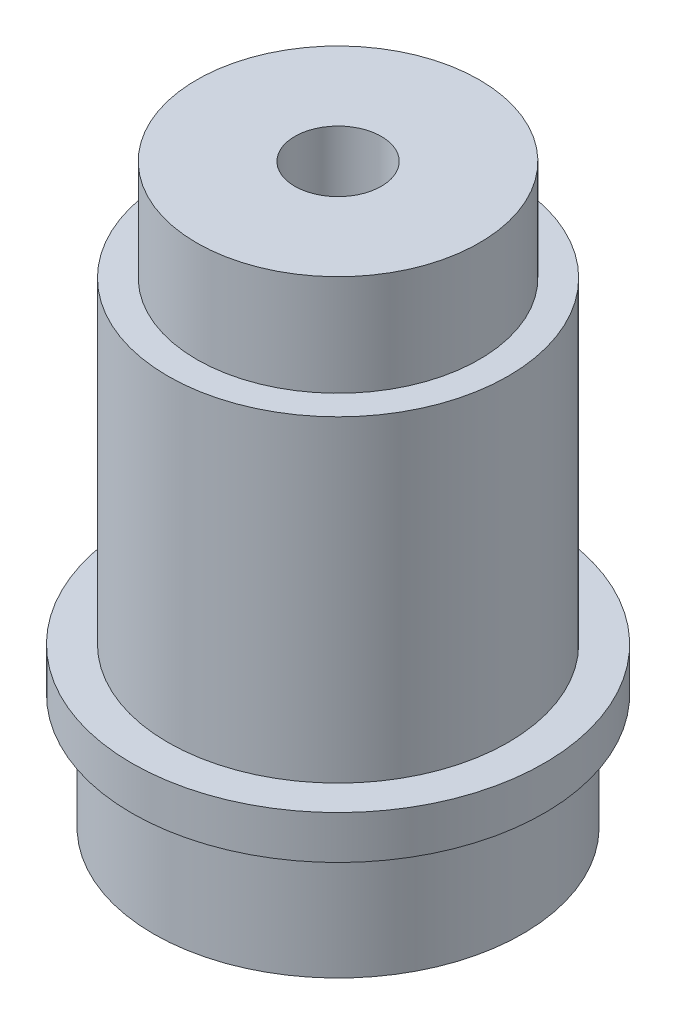
ISO-10303-21;
HEADER;
FILE_DESCRIPTION(('STEP AP214'),'2;1');
FILE_NAME('part.step','',(''),(''),'','','');
FILE_SCHEMA(('AUTOMOTIVE_DESIGN { 1 0 10303 214 1 1 1 1 }'));
ENDSEC;
DATA;
#1=APPLICATION_CONTEXT('core data for automotive mechanical design processes');
#2=APPLICATION_PROTOCOL_DEFINITION('international standard','automotive_design',2000,#1);
#3=PRODUCT_CONTEXT('',#1,'mechanical');
#4=PRODUCT('Part','Part','',(#3));
#5=PRODUCT_RELATED_PRODUCT_CATEGORY('part','',(#4));
#6=PRODUCT_DEFINITION_FORMATION('','',#4);
#7=PRODUCT_DEFINITION_CONTEXT('part definition',#1,'design');
#8=PRODUCT_DEFINITION('design','',#6,#7);
#9=PRODUCT_DEFINITION_SHAPE('','',#8);
#10=(LENGTH_UNIT() NAMED_UNIT(*) SI_UNIT(.MILLI.,.METRE.));
#11=(NAMED_UNIT(*) PLANE_ANGLE_UNIT() SI_UNIT($,.RADIAN.));
#12=(NAMED_UNIT(*) SI_UNIT($,.STERADIAN.) SOLID_ANGLE_UNIT());
#13=UNCERTAINTY_MEASURE_WITH_UNIT(LENGTH_MEASURE(1.E-05),#10,'distance_accuracy_value','');
#14=(GEOMETRIC_REPRESENTATION_CONTEXT(3) GLOBAL_UNCERTAINTY_ASSIGNED_CONTEXT((#13)) GLOBAL_UNIT_ASSIGNED_CONTEXT((#10,
#11,#12)) REPRESENTATION_CONTEXT('',''));
#15=CARTESIAN_POINT('',(0.,0.,0.));
#16=DIRECTION('',(0.,0.,1.));
#17=DIRECTION('',(1.,0.,0.));
#18=AXIS2_PLACEMENT_3D('',#15,#16,#17);
#19=CARTESIAN_POINT('',(0.,4.,0.));
#20=DIRECTION('',(0.,-1.,0.));
#21=DIRECTION('',(0.,0.,-1.));
#22=AXIS2_PLACEMENT_3D('',#19,#20,#21);
#23=CYLINDRICAL_SURFACE('',#22,6.4);
#24=CARTESIAN_POINT('',(0.,4.,0.));
#25=DIRECTION('',(0.,1.,0.));
#26=DIRECTION('',(0.,0.,1.));
#27=AXIS2_PLACEMENT_3D('',#24,#25,#26);
#28=CIRCLE('',#27,6.4);
#29=CARTESIAN_POINT('',(0.,4.,6.4));
#30=VERTEX_POINT('',#29);
#31=EDGE_CURVE('E45',#30,#30,#28,.T.);
#32=ORIENTED_EDGE('',*,*,#31,.F.);
#33=EDGE_LOOP('',(#32));
#34=FACE_BOUND('',#33,.T.);
#35=CARTESIAN_POINT('',(0.,0.,0.));
#36=DIRECTION('',(0.,1.,0.));
#37=DIRECTION('',(0.,0.,1.));
#38=AXIS2_PLACEMENT_3D('',#35,#36,#37);
#39=CIRCLE('',#38,6.4);
#40=CARTESIAN_POINT('',(0.,0.,6.4));
#41=VERTEX_POINT('',#40);
#42=EDGE_CURVE('E36',#41,#41,#39,.T.);
#43=ORIENTED_EDGE('',*,*,#42,.T.);
#44=EDGE_LOOP('',(#43));
#45=FACE_BOUND('',#44,.T.);
#46=ADVANCED_FACE('F33',(#34,#45),#23,.T.);
#47=CARTESIAN_POINT('',(0.,0.,0.));
#48=DIRECTION('',(0.,1.,0.));
#49=DIRECTION('',(0.,0.,1.));
#50=AXIS2_PLACEMENT_3D('',#47,#48,#49);
#51=PLANE('',#50);
#52=CARTESIAN_POINT('',(0.,0.,0.));
#53=DIRECTION('',(0.,-1.,0.));
#54=DIRECTION('',(0.,0.,-1.));
#55=AXIS2_PLACEMENT_3D('',#52,#53,#54);
#56=CIRCLE('',#55,5.);
#57=CARTESIAN_POINT('',(0.,0.,-5.));
#58=VERTEX_POINT('',#57);
#59=EDGE_CURVE('E122',#58,#58,#56,.T.);
#60=ORIENTED_EDGE('',*,*,#59,.F.);
#61=EDGE_LOOP('',(#60));
#62=FACE_BOUND('',#61,.T.);
#63=ORIENTED_EDGE('',*,*,#42,.F.);
#64=EDGE_LOOP('',(#63));
#65=FACE_BOUND('',#64,.T.);
#66=ADVANCED_FACE('F66',(#62,#65),#51,.F.);
#67=CARTESIAN_POINT('',(0.,5.5,0.));
#68=DIRECTION('',(0.,-1.,0.));
#69=DIRECTION('',(0.,0.,-1.));
#70=AXIS2_PLACEMENT_3D('',#67,#68,#69);
#71=CYLINDRICAL_SURFACE('',#70,7.15);
#72=CARTESIAN_POINT('',(0.,5.5,0.));
#73=DIRECTION('',(0.,1.,0.));
#74=DIRECTION('',(0.,0.,1.));
#75=AXIS2_PLACEMENT_3D('',#72,#73,#74);
#76=CIRCLE('',#75,7.15);
#77=CARTESIAN_POINT('',(0.,5.5,7.15));
#78=VERTEX_POINT('',#77);
#79=EDGE_CURVE('E55',#78,#78,#76,.T.);
#80=ORIENTED_EDGE('',*,*,#79,.F.);
#81=EDGE_LOOP('',(#80));
#82=FACE_BOUND('',#81,.T.);
#83=CARTESIAN_POINT('',(0.,4.,0.));
#84=DIRECTION('',(0.,1.,0.));
#85=DIRECTION('',(0.,0.,1.));
#86=AXIS2_PLACEMENT_3D('',#83,#84,#85);
#87=CIRCLE('',#86,7.15);
#88=CARTESIAN_POINT('',(0.,4.,7.15));
#89=VERTEX_POINT('',#88);
#90=EDGE_CURVE('E53',#89,#89,#87,.T.);
#91=ORIENTED_EDGE('',*,*,#90,.T.);
#92=EDGE_LOOP('',(#91));
#93=FACE_BOUND('',#92,.T.);
#94=ADVANCED_FACE('F68',(#82,#93),#71,.T.);
#95=CARTESIAN_POINT('',(0.,5.5,0.));
#96=DIRECTION('',(0.,1.,0.));
#97=DIRECTION('',(0.,0.,1.));
#98=AXIS2_PLACEMENT_3D('',#95,#96,#97);
#99=PLANE('',#98);
#100=CARTESIAN_POINT('',(0.,5.5,0.));
#101=DIRECTION('',(0.,1.,0.));
#102=DIRECTION('',(0.,0.,1.));
#103=AXIS2_PLACEMENT_3D('',#100,#101,#102);
#104=CIRCLE('',#103,5.9);
#105=CARTESIAN_POINT('',(0.,5.5,5.9));
#106=VERTEX_POINT('',#105);
#107=EDGE_CURVE('E40',#106,#106,#104,.T.);
#108=ORIENTED_EDGE('',*,*,#107,.F.);
#109=EDGE_LOOP('',(#108));
#110=FACE_BOUND('',#109,.T.);
#111=ORIENTED_EDGE('',*,*,#79,.T.);
#112=EDGE_LOOP('',(#111));
#113=FACE_BOUND('',#112,.T.);
#114=ADVANCED_FACE('F74',(#110,#113),#99,.T.);
#115=CARTESIAN_POINT('',(0.,4.,0.));
#116=DIRECTION('',(0.,1.,0.));
#117=DIRECTION('',(0.,0.,1.));
#118=AXIS2_PLACEMENT_3D('',#115,#116,#117);
#119=PLANE('',#118);
#120=ORIENTED_EDGE('',*,*,#31,.T.);
#121=EDGE_LOOP('',(#120));
#122=FACE_BOUND('',#121,.T.);
#123=ORIENTED_EDGE('',*,*,#90,.F.);
#124=EDGE_LOOP('',(#123));
#125=FACE_BOUND('',#124,.T.);
#126=ADVANCED_FACE('F80',(#122,#125),#119,.F.);
#127=CARTESIAN_POINT('',(0.,16.5,0.));
#128=DIRECTION('',(0.,-1.,0.));
#129=DIRECTION('',(0.,0.,-1.));
#130=AXIS2_PLACEMENT_3D('',#127,#128,#129);
#131=CYLINDRICAL_SURFACE('',#130,5.9);
#132=CARTESIAN_POINT('',(0.,16.5,0.));
#133=DIRECTION('',(0.,1.,0.));
#134=DIRECTION('',(0.,0.,1.));
#135=AXIS2_PLACEMENT_3D('',#132,#133,#134);
#136=CIRCLE('',#135,5.9);
#137=CARTESIAN_POINT('',(0.,16.5,5.9));
#138=VERTEX_POINT('',#137);
#139=EDGE_CURVE('E51',#138,#138,#136,.T.);
#140=ORIENTED_EDGE('',*,*,#139,.F.);
#141=EDGE_LOOP('',(#140));
#142=FACE_BOUND('',#141,.T.);
#143=ORIENTED_EDGE('',*,*,#107,.T.);
#144=EDGE_LOOP('',(#143));
#145=FACE_BOUND('',#144,.T.);
#146=ADVANCED_FACE('F83',(#142,#145),#131,.T.);
#147=CARTESIAN_POINT('',(0.,16.5,0.));
#148=DIRECTION('',(0.,1.,0.));
#149=DIRECTION('',(0.,0.,1.));
#150=AXIS2_PLACEMENT_3D('',#147,#148,#149);
#151=PLANE('',#150);
#152=CARTESIAN_POINT('',(0.,16.5,0.));
#153=DIRECTION('',(0.,1.,0.));
#154=DIRECTION('',(0.,0.,1.));
#155=AXIS2_PLACEMENT_3D('',#152,#153,#154);
#156=CIRCLE('',#155,4.9);
#157=CARTESIAN_POINT('',(0.,16.5,4.9));
#158=VERTEX_POINT('',#157);
#159=EDGE_CURVE('E10',#158,#158,#156,.T.);
#160=ORIENTED_EDGE('',*,*,#159,.F.);
#161=EDGE_LOOP('',(#160));
#162=FACE_BOUND('',#161,.T.);
#163=ORIENTED_EDGE('',*,*,#139,.T.);
#164=EDGE_LOOP('',(#163));
#165=FACE_BOUND('',#164,.T.);
#166=ADVANCED_FACE('F89',(#162,#165),#151,.T.);
#167=CARTESIAN_POINT('',(0.,20.,0.));
#168=DIRECTION('',(0.,-1.,0.));
#169=DIRECTION('',(0.,0.,-1.));
#170=AXIS2_PLACEMENT_3D('',#167,#168,#169);
#171=CYLINDRICAL_SURFACE('',#170,4.9);
#172=CARTESIAN_POINT('',(0.,20.,0.));
#173=DIRECTION('',(0.,1.,0.));
#174=DIRECTION('',(0.,0.,1.));
#175=AXIS2_PLACEMENT_3D('',#172,#173,#174);
#176=CIRCLE('',#175,4.9);
#177=CARTESIAN_POINT('',(0.,20.,4.9));
#178=VERTEX_POINT('',#177);
#179=EDGE_CURVE('E49',#178,#178,#176,.T.);
#180=ORIENTED_EDGE('',*,*,#179,.F.);
#181=EDGE_LOOP('',(#180));
#182=FACE_BOUND('',#181,.T.);
#183=ORIENTED_EDGE('',*,*,#159,.T.);
#184=EDGE_LOOP('',(#183));
#185=FACE_BOUND('',#184,.T.);
#186=ADVANCED_FACE('F93',(#182,#185),#171,.T.);
#187=CARTESIAN_POINT('',(0.,20.,0.));
#188=DIRECTION('',(0.,1.,0.));
#189=DIRECTION('',(0.,0.,1.));
#190=AXIS2_PLACEMENT_3D('',#187,#188,#189);
#191=PLANE('',#190);
#192=CARTESIAN_POINT('',(0.,20.,0.));
#193=DIRECTION('',(0.,1.,0.));
#194=DIRECTION('',(0.,0.,1.));
#195=AXIS2_PLACEMENT_3D('',#192,#193,#194);
#196=CIRCLE('',#195,1.5);
#197=CARTESIAN_POINT('',(0.,20.,1.5));
#198=VERTEX_POINT('',#197);
#199=EDGE_CURVE('E118',#198,#198,#196,.T.);
#200=ORIENTED_EDGE('',*,*,#199,.F.);
#201=EDGE_LOOP('',(#200));
#202=FACE_BOUND('',#201,.T.);
#203=ORIENTED_EDGE('',*,*,#179,.T.);
#204=EDGE_LOOP('',(#203));
#205=FACE_BOUND('',#204,.T.);
#206=ADVANCED_FACE('F97',(#202,#205),#191,.T.);
#207=CARTESIAN_POINT('',(0.,15.,0.));
#208=DIRECTION('',(0.,-1.,0.));
#209=DIRECTION('',(0.,0.,-1.));
#210=AXIS2_PLACEMENT_3D('',#207,#208,#209);
#211=CYLINDRICAL_SURFACE('',#210,5.);
#212=CARTESIAN_POINT('',(0.,15.,0.));
#213=DIRECTION('',(0.,-1.,0.));
#214=DIRECTION('',(0.,0.,-1.));
#215=AXIS2_PLACEMENT_3D('',#212,#213,#214);
#216=CIRCLE('',#215,5.);
#217=CARTESIAN_POINT('',(0.,15.,-5.));
#218=VERTEX_POINT('',#217);
#219=EDGE_CURVE('E125',#218,#218,#216,.T.);
#220=ORIENTED_EDGE('',*,*,#219,.F.);
#221=EDGE_LOOP('',(#220));
#222=FACE_BOUND('',#221,.T.);
#223=ORIENTED_EDGE('',*,*,#59,.T.);
#224=EDGE_LOOP('',(#223));
#225=FACE_BOUND('',#224,.T.);
#226=ADVANCED_FACE('F101',(#222,#225),#211,.F.);
#227=CARTESIAN_POINT('',(0.,15.,0.));
#228=DIRECTION('',(0.,-1.,0.));
#229=DIRECTION('',(0.,0.,-1.));
#230=AXIS2_PLACEMENT_3D('',#227,#228,#229);
#231=PLANE('',#230);
#232=CARTESIAN_POINT('',(0.,15.,0.));
#233=DIRECTION('',(0.,-1.,0.));
#234=DIRECTION('',(0.,0.,-1.));
#235=AXIS2_PLACEMENT_3D('',#232,#233,#234);
#236=CIRCLE('',#235,1.5);
#237=CARTESIAN_POINT('',(0.,15.,-1.5));
#238=VERTEX_POINT('',#237);
#239=EDGE_CURVE('E121',#238,#238,#236,.F.);
#240=ORIENTED_EDGE('',*,*,#239,.T.);
#241=EDGE_LOOP('',(#240));
#242=FACE_BOUND('',#241,.T.);
#243=ORIENTED_EDGE('',*,*,#219,.T.);
#244=EDGE_LOOP('',(#243));
#245=FACE_BOUND('',#244,.T.);
#246=ADVANCED_FACE('F105',(#242,#245),#231,.T.);
#247=CARTESIAN_POINT('',(0.,10.7573593128807,0.));
#248=DIRECTION('',(0.,1.,0.));
#249=DIRECTION('',(0.,0.,1.));
#250=AXIS2_PLACEMENT_3D('',#247,#248,#249);
#251=CYLINDRICAL_SURFACE('',#250,1.5);
#252=ORIENTED_EDGE('',*,*,#199,.T.);
#253=EDGE_LOOP('',(#252));
#254=FACE_BOUND('',#253,.T.);
#255=ORIENTED_EDGE('',*,*,#239,.F.);
#256=EDGE_LOOP('',(#255));
#257=FACE_BOUND('',#256,.T.);
#258=ADVANCED_FACE('F109',(#254,#257),#251,.F.);
#259=CLOSED_SHELL('',(#46,#66,#94,#114,#126,#146,#166,#186,#206,#226,#246,#258));
#260=MANIFOLD_SOLID_BREP('B2',#259);
#261=ADVANCED_BREP_SHAPE_REPRESENTATION('',(#18,#260),#14);
#262=SHAPE_DEFINITION_REPRESENTATION(#9,#261);
ENDSEC;
END-ISO-10303-21;
